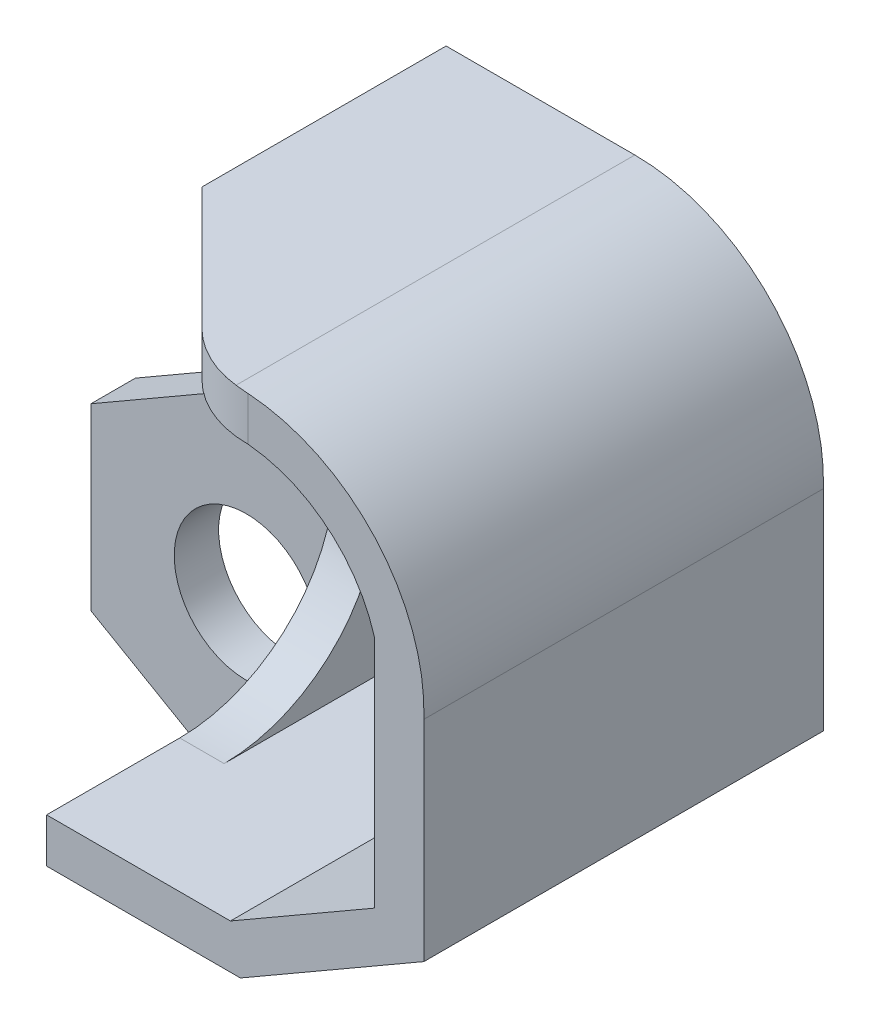
ISO-10303-21;
HEADER;
FILE_DESCRIPTION(('STEP AP214'),'2;1');
FILE_NAME('part.step','',(''),(''),'','','');
FILE_SCHEMA(('AUTOMOTIVE_DESIGN { 1 0 10303 214 1 1 1 1 }'));
ENDSEC;
DATA;
#1=APPLICATION_CONTEXT('core data for automotive mechanical design processes');
#2=APPLICATION_PROTOCOL_DEFINITION('international standard','automotive_design',2000,#1);
#3=PRODUCT_CONTEXT('',#1,'mechanical');
#4=PRODUCT('Part','Part','',(#3));
#5=PRODUCT_RELATED_PRODUCT_CATEGORY('part','',(#4));
#6=PRODUCT_DEFINITION_FORMATION('','',#4);
#7=PRODUCT_DEFINITION_CONTEXT('part definition',#1,'design');
#8=PRODUCT_DEFINITION('design','',#6,#7);
#9=PRODUCT_DEFINITION_SHAPE('','',#8);
#10=(LENGTH_UNIT() NAMED_UNIT(*) SI_UNIT(.MILLI.,.METRE.));
#11=(NAMED_UNIT(*) PLANE_ANGLE_UNIT() SI_UNIT($,.RADIAN.));
#12=(NAMED_UNIT(*) SI_UNIT($,.STERADIAN.) SOLID_ANGLE_UNIT());
#13=UNCERTAINTY_MEASURE_WITH_UNIT(LENGTH_MEASURE(1.E-05),#10,'distance_accuracy_value','');
#14=(GEOMETRIC_REPRESENTATION_CONTEXT(3) GLOBAL_UNCERTAINTY_ASSIGNED_CONTEXT((#13)) GLOBAL_UNIT_ASSIGNED_CONTEXT((#10,
#11,#12)) REPRESENTATION_CONTEXT('',''));
#15=CARTESIAN_POINT('',(0.,0.,0.));
#16=DIRECTION('',(0.,0.,1.));
#17=DIRECTION('',(1.,0.,0.));
#18=AXIS2_PLACEMENT_3D('',#15,#16,#17);
#19=CARTESIAN_POINT('',(15.5043494841321,15.5,2.));
#20=DIRECTION('',(0.,0.,-1.));
#21=DIRECTION('',(-1.,0.,0.));
#22=AXIS2_PLACEMENT_3D('',#19,#20,#21);
#23=PLANE('',#22);
#24=CARTESIAN_POINT('',(0.,0.,2.));
#25=DIRECTION('',(0.,0.,1.));
#26=DIRECTION('',(1.,0.,0.));
#27=AXIS2_PLACEMENT_3D('',#24,#25,#26);
#28=CIRCLE('',#27,3.25);
#29=CARTESIAN_POINT('',(3.25,0.,2.));
#30=VERTEX_POINT('',#29);
#31=EDGE_CURVE('E268',#30,#30,#28,.T.);
#32=ORIENTED_EDGE('',*,*,#31,.F.);
#33=EDGE_LOOP('',(#32));
#34=FACE_BOUND('',#33,.T.);
#35=DIRECTION('',(0.86602540378444,0.499999999999998,0.));
#36=VECTOR('',#35,1.);
#37=CARTESIAN_POINT('',(24.,5.7735026918962,2.));
#38=LINE('',#37,#36);
#39=CARTESIAN_POINT('',(1.87564434701784,-7.,2.));
#40=VERTEX_POINT('',#39);
#41=CARTESIAN_POINT('',(7.07269458429815,-3.99948164651422,2.));
#42=VERTEX_POINT('',#41);
#43=EDGE_CURVE('E286',#40,#42,#38,.T.);
#44=ORIENTED_EDGE('',*,*,#43,.T.);
#45=CARTESIAN_POINT('',(-10.4641016151379,-4.,2.));
#46=CARTESIAN_POINT('',(-4.64273441009191,-4.,2.));
#47=CARTESIAN_POINT('',(1.17863279495404,-4.,2.));
#48=CARTESIAN_POINT('',(7.,-4.,2.));
#49=CARTESIAN_POINT('',(9.91068360252297,-4.,2.));
#50=CARTESIAN_POINT('',(12.8213672050459,-1.5,2.));
#51=CARTESIAN_POINT('',(15.7320508075689,1.,2.));
#52=(BOUNDED_CURVE() B_SPLINE_CURVE(3,(#45,#46,#47,#48,#49,#50,#51),.UNSPECIFIED.,.F.,
.F.) B_SPLINE_CURVE_WITH_KNOTS((4,3,4),(-0.0174641016151379,0.,0.00873205080756893),
.UNSPECIFIED.) CURVE() GEOMETRIC_REPRESENTATION_ITEM() RATIONAL_B_SPLINE_CURVE((1.,1.,1.,1.,1.,
1.,1.)) REPRESENTATION_ITEM(''));
#53=CARTESIAN_POINT('',(7.,-4.,2.));
#54=VERTEX_POINT('',#53);
#55=EDGE_CURVE('E385',#42,#54,#52,.F.);
#56=ORIENTED_EDGE('',*,*,#55,.T.);
#57=DIRECTION('',(0.,-1.,0.));
#58=VECTOR('',#57,1.);
#59=CARTESIAN_POINT('',(7.,1.,2.));
#60=LINE('',#59,#58);
#61=CARTESIAN_POINT('',(7.,7.,2.));
#62=VERTEX_POINT('',#61);
#63=EDGE_CURVE('E235',#62,#54,#60,.T.);
#64=ORIENTED_EDGE('',*,*,#63,.F.);
#65=DIRECTION('',(-1.,0.,0.));
#66=VECTOR('',#65,1.);
#67=CARTESIAN_POINT('',(-1.87564434701784,7.,2.));
#68=LINE('',#67,#66);
#69=CARTESIAN_POINT('',(-1.87564434701784,7.,2.));
#70=VERTEX_POINT('',#69);
#71=EDGE_CURVE('E283',#62,#70,#68,.T.);
#72=ORIENTED_EDGE('',*,*,#71,.T.);
#73=DIRECTION('',(-0.86602540378444,-0.499999999999998,0.));
#74=VECTOR('',#73,1.);
#75=CARTESIAN_POINT('',(-6.99999999999999,4.04145188432739,2.));
#76=LINE('',#75,#74);
#77=CARTESIAN_POINT('',(-6.99999999999999,4.04145188432739,2.));
#78=VERTEX_POINT('',#77);
#79=EDGE_CURVE('E585',#70,#78,#76,.T.);
#80=ORIENTED_EDGE('',*,*,#79,.T.);
#81=DIRECTION('',(0.,-1.,0.));
#82=VECTOR('',#81,1.);
#83=CARTESIAN_POINT('',(-6.99999999999999,-4.04145188432739,2.));
#84=LINE('',#83,#82);
#85=CARTESIAN_POINT('',(-6.99999999999999,-4.04145188432739,2.));
#86=VERTEX_POINT('',#85);
#87=EDGE_CURVE('E514',#78,#86,#84,.T.);
#88=ORIENTED_EDGE('',*,*,#87,.T.);
#89=DIRECTION('',(0.86602540378444,-0.499999999999998,0.));
#90=VECTOR('',#89,1.);
#91=CARTESIAN_POINT('',(-1.87564434701784,-7.,2.));
#92=LINE('',#91,#90);
#93=CARTESIAN_POINT('',(-1.87564434701784,-7.,2.));
#94=VERTEX_POINT('',#93);
#95=EDGE_CURVE('E274',#86,#94,#92,.T.);
#96=ORIENTED_EDGE('',*,*,#95,.T.);
#97=DIRECTION('',(1.,0.,0.));
#98=VECTOR('',#97,1.);
#99=CARTESIAN_POINT('',(-1.87564434701784,-7.,2.));
#100=LINE('',#99,#98);
#101=EDGE_CURVE('E277',#94,#40,#100,.T.);
#102=ORIENTED_EDGE('',*,*,#101,.T.);
#103=EDGE_LOOP('',(#44,#56,#64,#72,#80,#88,#96,#102));
#104=FACE_BOUND('',#103,.T.);
#105=ADVANCED_FACE('F33',(#34,#104),#23,.F.);
#106=CARTESIAN_POINT('',(15.5043494841321,15.5,2.));
#107=DIRECTION('',(0.,0.,1.));
#108=DIRECTION('',(-1.,0.,0.));
#109=AXIS2_PLACEMENT_3D('',#106,#107,#108);
#110=CIRCLE('',#109,4.25);
#111=CARTESIAN_POINT('',(11.2543494841321,15.5,2.));
#112=VERTEX_POINT('',#111);
#113=EDGE_CURVE('E262',#112,#112,#110,.T.);
#114=ORIENTED_EDGE('',*,*,#113,.F.);
#115=EDGE_LOOP('',(#114));
#116=FACE_BOUND('',#115,.T.);
#117=DIRECTION('',(0.,1.,0.));
#118=VECTOR('',#117,1.);
#119=CARTESIAN_POINT('',(9.,22.,2.));
#120=LINE('',#119,#118);
#121=CARTESIAN_POINT('',(9.,3.,2.));
#122=VERTEX_POINT('',#121);
#123=CARTESIAN_POINT('',(9.,22.,2.));
#124=VERTEX_POINT('',#123);
#125=EDGE_CURVE('E211',#122,#124,#120,.T.);
#126=ORIENTED_EDGE('',*,*,#125,.F.);
#127=DIRECTION('',(-1.,0.,0.));
#128=VECTOR('',#127,1.);
#129=CARTESIAN_POINT('',(7.,3.,2.));
#130=LINE('',#129,#128);
#131=CARTESIAN_POINT('',(15.282660159026,3.,2.));
#132=VERTEX_POINT('',#131);
#133=EDGE_CURVE('E224',#132,#122,#130,.T.);
#134=ORIENTED_EDGE('',*,*,#133,.F.);
#135=DIRECTION('',(-0.866025403784439,-0.5,0.));
#136=VECTOR('',#135,1.);
#137=CARTESIAN_POINT('',(15.282660159026,3.,2.));
#138=LINE('',#137,#136);
#139=CARTESIAN_POINT('',(21.77610161737,6.748990173942,2.));
#140=VERTEX_POINT('',#139);
#141=EDGE_CURVE('E236',#140,#132,#138,.T.);
#142=ORIENTED_EDGE('',*,*,#141,.F.);
#143=DIRECTION('',(0.,-1.,0.));
#144=VECTOR('',#143,1.);
#145=CARTESIAN_POINT('',(21.77610161737,17.3027274781325,2.));
#146=LINE('',#145,#144);
#147=CARTESIAN_POINT('',(21.77610161737,17.3027274781325,2.));
#148=VERTEX_POINT('',#147);
#149=EDGE_CURVE('E240',#148,#140,#146,.T.);
#150=ORIENTED_EDGE('',*,*,#149,.F.);
#151=CARTESIAN_POINT('',(15.5043494841321,15.5,2.));
#152=DIRECTION('',(0.,0.,-1.));
#153=DIRECTION('',(1.,0.,0.));
#154=AXIS2_PLACEMENT_3D('',#151,#152,#153);
#155=CIRCLE('',#154,6.5256954557494);
#156=CARTESIAN_POINT('',(16.0828831315446,22.,2.));
#157=VERTEX_POINT('',#156);
#158=EDGE_CURVE('E297',#157,#148,#155,.T.);
#159=ORIENTED_EDGE('',*,*,#158,.F.);
#160=DIRECTION('',(1.,0.,0.));
#161=VECTOR('',#160,1.);
#162=CARTESIAN_POINT('',(7.,22.,2.));
#163=LINE('',#162,#161);
#164=EDGE_CURVE('E218',#124,#157,#163,.T.);
#165=ORIENTED_EDGE('',*,*,#164,.F.);
#166=EDGE_LOOP('',(#126,#134,#142,#150,#159,#165));
#167=FACE_BOUND('',#166,.T.);
#168=ADVANCED_FACE('F223',(#116,#167),#23,.F.);
#169=CARTESIAN_POINT('',(7.,22.,18.));
#170=DIRECTION('',(0.,1.,0.));
#171=DIRECTION('',(0.,0.,1.));
#172=AXIS2_PLACEMENT_3D('',#169,#170,#171);
#173=PLANE('',#172);
#174=DIRECTION('',(1.,0.,0.));
#175=VECTOR('',#174,1.);
#176=CARTESIAN_POINT('',(7.,22.,18.));
#177=LINE('',#176,#175);
#178=CARTESIAN_POINT('',(16.0710678118655,22.,18.));
#179=VERTEX_POINT('',#178);
#180=CARTESIAN_POINT('',(16.0828831315446,22.,18.));
#181=VERTEX_POINT('',#180);
#182=EDGE_CURVE('E238',#179,#181,#177,.T.);
#183=ORIENTED_EDGE('',*,*,#182,.F.);
#184=CARTESIAN_POINT('',(16.0710678118655,22.,13.));
#185=DIRECTION('',(0.,1.,0.));
#186=DIRECTION('',(0.,0.,1.));
#187=AXIS2_PLACEMENT_3D('',#184,#185,#186);
#188=CIRCLE('',#187,5.);
#189=CARTESIAN_POINT('',(12.5355339059327,22.,16.5355339059327));
#190=VERTEX_POINT('',#189);
#191=EDGE_CURVE('E605',#179,#190,#188,.F.);
#192=ORIENTED_EDGE('',*,*,#191,.T.);
#193=DIRECTION('',(-0.707106781186546,0.,-0.707106781186549));
#194=VECTOR('',#193,1.);
#195=CARTESIAN_POINT('',(14.,22.,18.));
#196=LINE('',#195,#194);
#197=CARTESIAN_POINT('',(8.00000000000001,22.,12.));
#198=VERTEX_POINT('',#197);
#199=EDGE_CURVE('E615',#190,#198,#196,.T.);
#200=ORIENTED_EDGE('',*,*,#199,.T.);
#201=DIRECTION('',(-1.,0.,0.));
#202=VECTOR('',#201,1.);
#203=CARTESIAN_POINT('',(7.,22.,12.));
#204=LINE('',#203,#202);
#205=CARTESIAN_POINT('',(9.,22.,12.));
#206=VERTEX_POINT('',#205);
#207=EDGE_CURVE('E624',#198,#206,#204,.F.);
#208=ORIENTED_EDGE('',*,*,#207,.T.);
#209=DIRECTION('',(0.,0.,-1.));
#210=VECTOR('',#209,1.);
#211=CARTESIAN_POINT('',(9.,22.,5.));
#212=LINE('',#211,#210);
#213=EDGE_CURVE('E219',#206,#124,#212,.T.);
#214=ORIENTED_EDGE('',*,*,#213,.T.);
#215=ORIENTED_EDGE('',*,*,#164,.T.);
#216=DIRECTION('',(0.,0.,-1.));
#217=VECTOR('',#216,1.);
#218=CARTESIAN_POINT('',(16.0828831315446,22.,18.));
#219=LINE('',#218,#217);
#220=EDGE_CURVE('E258',#181,#157,#219,.T.);
#221=ORIENTED_EDGE('',*,*,#220,.F.);
#222=EDGE_LOOP('',(#183,#192,#200,#208,#214,#215,#221));
#223=FACE_BOUND('',#222,.T.);
#224=ADVANCED_FACE('F328',(#223),#173,.F.);
#225=CARTESIAN_POINT('',(7.,3.,18.));
#226=DIRECTION('',(0.,-1.,0.));
#227=DIRECTION('',(1.,0.,0.));
#228=AXIS2_PLACEMENT_3D('',#225,#226,#227);
#229=PLANE('',#228);
#230=DIRECTION('',(0.,0.,-1.));
#231=VECTOR('',#230,1.);
#232=CARTESIAN_POINT('',(9.,3.,5.));
#233=LINE('',#232,#231);
#234=CARTESIAN_POINT('',(9.,3.,12.));
#235=VERTEX_POINT('',#234);
#236=EDGE_CURVE('E207',#235,#122,#233,.T.);
#237=ORIENTED_EDGE('',*,*,#236,.F.);
#238=DIRECTION('',(1.,0.,0.));
#239=VECTOR('',#238,1.);
#240=CARTESIAN_POINT('',(7.,3.,12.));
#241=LINE('',#240,#239);
#242=CARTESIAN_POINT('',(7.,3.,12.));
#243=VERTEX_POINT('',#242);
#244=EDGE_CURVE('E626',#235,#243,#241,.F.);
#245=ORIENTED_EDGE('',*,*,#244,.T.);
#246=DIRECTION('',(0.,0.,-1.));
#247=VECTOR('',#246,1.);
#248=CARTESIAN_POINT('',(7.,3.,18.));
#249=LINE('',#248,#247);
#250=CARTESIAN_POINT('',(7.,3.,18.));
#251=VERTEX_POINT('',#250);
#252=EDGE_CURVE('E247',#251,#243,#249,.T.);
#253=ORIENTED_EDGE('',*,*,#252,.F.);
#254=DIRECTION('',(-1.,0.,0.));
#255=VECTOR('',#254,1.);
#256=CARTESIAN_POINT('',(7.,3.,18.));
#257=LINE('',#256,#255);
#258=CARTESIAN_POINT('',(15.282660159026,3.,18.));
#259=VERTEX_POINT('',#258);
#260=EDGE_CURVE('E557',#259,#251,#257,.T.);
#261=ORIENTED_EDGE('',*,*,#260,.F.);
#262=DIRECTION('',(0.,0.,-1.));
#263=VECTOR('',#262,1.);
#264=CARTESIAN_POINT('',(15.282660159026,3.,18.));
#265=LINE('',#264,#263);
#266=EDGE_CURVE('E234',#259,#132,#265,.T.);
#267=ORIENTED_EDGE('',*,*,#266,.T.);
#268=ORIENTED_EDGE('',*,*,#133,.T.);
#269=EDGE_LOOP('',(#237,#245,#253,#261,#267,#268));
#270=FACE_BOUND('',#269,.T.);
#271=ADVANCED_FACE('F231',(#270),#229,.F.);
#272=CARTESIAN_POINT('',(15.5043494841321,15.5,0.));
#273=DIRECTION('',(0.,0.,-1.));
#274=DIRECTION('',(-1.,0.,0.));
#275=AXIS2_PLACEMENT_3D('',#272,#273,#274);
#276=PLANE('',#275);
#277=CARTESIAN_POINT('',(0.,0.,0.));
#278=DIRECTION('',(0.,0.,1.));
#279=DIRECTION('',(1.,0.,0.));
#280=AXIS2_PLACEMENT_3D('',#277,#278,#279);
#281=CIRCLE('',#280,3.25);
#282=CARTESIAN_POINT('',(3.25,0.,0.));
#283=VERTEX_POINT('',#282);
#284=EDGE_CURVE('E265',#283,#283,#281,.T.);
#285=ORIENTED_EDGE('',*,*,#284,.T.);
#286=EDGE_LOOP('',(#285));
#287=FACE_BOUND('',#286,.T.);
#288=DIRECTION('',(0.86602540378444,-0.499999999999998,0.));
#289=VECTOR('',#288,1.);
#290=CARTESIAN_POINT('',(-1.87564434701784,-7.,0.));
#291=LINE('',#290,#289);
#292=CARTESIAN_POINT('',(-6.99999999999999,-4.04145188432739,0.));
#293=VERTEX_POINT('',#292);
#294=CARTESIAN_POINT('',(-1.87564434701784,-7.,0.));
#295=VERTEX_POINT('',#294);
#296=EDGE_CURVE('E271',#293,#295,#291,.T.);
#297=ORIENTED_EDGE('',*,*,#296,.F.);
#298=DIRECTION('',(0.,-1.,0.));
#299=VECTOR('',#298,1.);
#300=CARTESIAN_POINT('',(-6.99999999999999,-4.04145188432739,0.));
#301=LINE('',#300,#299);
#302=CARTESIAN_POINT('',(-6.99999999999999,4.04145188432739,0.));
#303=VERTEX_POINT('',#302);
#304=EDGE_CURVE('E278',#303,#293,#301,.T.);
#305=ORIENTED_EDGE('',*,*,#304,.F.);
#306=DIRECTION('',(-0.86602540378444,-0.499999999999998,0.));
#307=VECTOR('',#306,1.);
#308=CARTESIAN_POINT('',(-6.99999999999999,4.04145188432739,0.));
#309=LINE('',#308,#307);
#310=CARTESIAN_POINT('',(-1.87564434701784,7.,0.));
#311=VERTEX_POINT('',#310);
#312=EDGE_CURVE('E507',#311,#303,#309,.T.);
#313=ORIENTED_EDGE('',*,*,#312,.F.);
#314=DIRECTION('',(-1.,0.,0.));
#315=VECTOR('',#314,1.);
#316=CARTESIAN_POINT('',(-1.87564434701784,7.,0.));
#317=LINE('',#316,#315);
#318=CARTESIAN_POINT('',(7.,7.,0.));
#319=VERTEX_POINT('',#318);
#320=EDGE_CURVE('E505',#319,#311,#317,.T.);
#321=ORIENTED_EDGE('',*,*,#320,.F.);
#322=DIRECTION('',(0.,-1.,0.));
#323=VECTOR('',#322,1.);
#324=CARTESIAN_POINT('',(7.,7.,0.));
#325=LINE('',#324,#323);
#326=CARTESIAN_POINT('',(7.,24.,0.));
#327=VERTEX_POINT('',#326);
#328=EDGE_CURVE('E503',#327,#319,#325,.T.);
#329=ORIENTED_EDGE('',*,*,#328,.F.);
#330=DIRECTION('',(-1.,0.,0.));
#331=VECTOR('',#330,1.);
#332=CARTESIAN_POINT('',(7.,24.,0.));
#333=LINE('',#332,#331);
#334=CARTESIAN_POINT('',(15.5043494841321,24.,0.));
#335=VERTEX_POINT('',#334);
#336=EDGE_CURVE('E500',#335,#327,#333,.T.);
#337=ORIENTED_EDGE('',*,*,#336,.F.);
#338=CARTESIAN_POINT('',(15.5043494841321,15.5,0.));
#339=DIRECTION('',(0.,0.,1.));
#340=DIRECTION('',(-1.,0.,0.));
#341=AXIS2_PLACEMENT_3D('',#338,#339,#340);
#342=CIRCLE('',#341,8.5);
#343=CARTESIAN_POINT('',(24.,15.2281134202769,0.));
#344=VERTEX_POINT('',#343);
#345=EDGE_CURVE('E494',#344,#335,#342,.T.);
#346=ORIENTED_EDGE('',*,*,#345,.F.);
#347=DIRECTION('',(0.,1.,0.));
#348=VECTOR('',#347,1.);
#349=CARTESIAN_POINT('',(24.,15.2281134202769,0.));
#350=LINE('',#349,#348);
#351=CARTESIAN_POINT('',(24.,5.7735026918962,0.));
#352=VERTEX_POINT('',#351);
#353=EDGE_CURVE('E492',#352,#344,#350,.T.);
#354=ORIENTED_EDGE('',*,*,#353,.F.);
#355=DIRECTION('',(0.86602540378444,0.499999999999998,0.));
#356=VECTOR('',#355,1.);
#357=CARTESIAN_POINT('',(24.,5.7735026918962,0.));
#358=LINE('',#357,#356);
#359=CARTESIAN_POINT('',(1.87564434701784,-7.,0.));
#360=VERTEX_POINT('',#359);
#361=EDGE_CURVE('E485',#360,#352,#358,.T.);
#362=ORIENTED_EDGE('',*,*,#361,.F.);
#363=DIRECTION('',(1.,0.,0.));
#364=VECTOR('',#363,1.);
#365=CARTESIAN_POINT('',(-1.87564434701784,-7.,0.));
#366=LINE('',#365,#364);
#367=EDGE_CURVE('E477',#295,#360,#366,.T.);
#368=ORIENTED_EDGE('',*,*,#367,.F.);
#369=EDGE_LOOP('',(#297,#305,#313,#321,#329,#337,#346,#354,#362,#368));
#370=FACE_BOUND('',#369,.T.);
#371=CARTESIAN_POINT('',(15.5043494841321,15.5,0.));
#372=DIRECTION('',(0.,0.,1.));
#373=DIRECTION('',(-1.,0.,0.));
#374=AXIS2_PLACEMENT_3D('',#371,#372,#373);
#375=CIRCLE('',#374,4.25);
#376=CARTESIAN_POINT('',(11.2543494841321,15.5,0.));
#377=VERTEX_POINT('',#376);
#378=EDGE_CURVE('E261',#377,#377,#375,.T.);
#379=ORIENTED_EDGE('',*,*,#378,.T.);
#380=EDGE_LOOP('',(#379));
#381=FACE_BOUND('',#380,.T.);
#382=ADVANCED_FACE('F327',(#287,#370,#381),#276,.T.);
#383=CARTESIAN_POINT('',(-1.87564434701784,-7.,2.));
#384=DIRECTION('',(0.499999999999998,0.86602540378444,0.));
#385=DIRECTION('',(-0.86602540378444,0.499999999999998,0.));
#386=AXIS2_PLACEMENT_3D('',#383,#384,#385);
#387=PLANE('',#386);
#388=ORIENTED_EDGE('',*,*,#296,.T.);
#389=DIRECTION('',(0.,0.,-1.));
#390=VECTOR('',#389,1.);
#391=CARTESIAN_POINT('',(-1.87564434701784,-7.,2.));
#392=LINE('',#391,#390);
#393=EDGE_CURVE('E290',#94,#295,#392,.T.);
#394=ORIENTED_EDGE('',*,*,#393,.F.);
#395=ORIENTED_EDGE('',*,*,#95,.F.);
#396=DIRECTION('',(0.,0.,-1.));
#397=VECTOR('',#396,1.);
#398=CARTESIAN_POINT('',(-6.99999999999999,-4.04145188432739,2.));
#399=LINE('',#398,#397);
#400=EDGE_CURVE('E510',#86,#293,#399,.T.);
#401=ORIENTED_EDGE('',*,*,#400,.T.);
#402=EDGE_LOOP('',(#388,#394,#395,#401));
#403=FACE_BOUND('',#402,.T.);
#404=ADVANCED_FACE('F357',(#403),#387,.F.);
#405=CARTESIAN_POINT('',(-1.87564434701784,-7.,2.));
#406=DIRECTION('',(0.,1.,0.));
#407=DIRECTION('',(0.,0.,1.));
#408=AXIS2_PLACEMENT_3D('',#405,#406,#407);
#409=PLANE('',#408);
#410=ORIENTED_EDGE('',*,*,#367,.T.);
#411=DIRECTION('',(0.,0.,-1.));
#412=VECTOR('',#411,1.);
#413=CARTESIAN_POINT('',(1.87564434701784,-7.,2.));
#414=LINE('',#413,#412);
#415=EDGE_CURVE('E479',#40,#360,#414,.T.);
#416=ORIENTED_EDGE('',*,*,#415,.F.);
#417=ORIENTED_EDGE('',*,*,#101,.F.);
#418=ORIENTED_EDGE('',*,*,#393,.T.);
#419=EDGE_LOOP('',(#410,#416,#417,#418));
#420=FACE_BOUND('',#419,.T.);
#421=ADVANCED_FACE('F468',(#420),#409,.F.);
#422=CARTESIAN_POINT('',(24.,5.7735026918962,2.));
#423=DIRECTION('',(-0.499999999999998,0.86602540378444,0.));
#424=DIRECTION('',(-0.86602540378444,-0.499999999999998,0.));
#425=AXIS2_PLACEMENT_3D('',#422,#423,#424);
#426=PLANE('',#425);
#427=ORIENTED_EDGE('',*,*,#361,.T.);
#428=DIRECTION('',(0.,0.,-1.));
#429=VECTOR('',#428,1.);
#430=CARTESIAN_POINT('',(24.,5.7735026918962,2.));
#431=LINE('',#430,#429);
#432=CARTESIAN_POINT('',(24.,5.7735026918962,18.));
#433=VERTEX_POINT('',#432);
#434=EDGE_CURVE('E488',#433,#352,#431,.T.);
#435=ORIENTED_EDGE('',*,*,#434,.F.);
#436=DIRECTION('',(0.866025403784439,0.5,0.));
#437=VECTOR('',#436,1.);
#438=CARTESIAN_POINT('',(15.732050807569,1.,18.));
#439=LINE('',#438,#437);
#440=CARTESIAN_POINT('',(15.732050807569,1.,18.));
#441=VERTEX_POINT('',#440);
#442=EDGE_CURVE('E536',#441,#433,#439,.T.);
#443=ORIENTED_EDGE('',*,*,#442,.F.);
#444=DIRECTION('',(0.,0.,-1.));
#445=VECTOR('',#444,1.);
#446=CARTESIAN_POINT('',(15.732050807569,1.,18.));
#447=LINE('',#446,#445);
#448=CARTESIAN_POINT('',(15.7320508075689,1.,2.));
#449=VERTEX_POINT('',#448);
#450=EDGE_CURVE('E248',#441,#449,#447,.T.);
#451=ORIENTED_EDGE('',*,*,#450,.T.);
#452=CARTESIAN_POINT('',(7.07269458429754,-3.99948164651344,2.));
#453=CARTESIAN_POINT('',(7.61835428858763,-3.68444486935609,1.99999999999976));
#454=CARTESIAN_POINT('',(8.22999648835141,-3.33131308067464,1.99999999999979));
#455=CARTESIAN_POINT('',(9.55225462022993,-2.56790699229604,2.00000000000046));
#456=CARTESIAN_POINT('',(10.2628705590933,-2.15763268870327,2.00000000000015));
#457=CARTESIAN_POINT('',(12.4936921039283,-0.869667269278817,2.00000000000012));
#458=CARTESIAN_POINT('',(14.1128714593411,0.0651663659197213,2.00000000442799));
#459=CARTESIAN_POINT('',(15.7320508075689,1.,2.));
#460=(BOUNDED_CURVE() B_SPLINE_CURVE(3,(#452,#453,#454,#455,#456,#457,#458,#459),.UNSPECIFIED.,
.F.,.F.) B_SPLINE_CURVE_WITH_KNOTS((4,2,2,4),(7.26945842973503E-05,0.00223753364011524,
0.00440237269593314,0.00873205080756893),
.UNSPECIFIED.) CURVE() GEOMETRIC_REPRESENTATION_ITEM() RATIONAL_B_SPLINE_CURVE((0.999999999999906,
0.999999999999913,0.999999999999917,0.999999999999924,0.999999999999926,0.999999999999931,
0.999999999999932,0.999999999999932)) REPRESENTATION_ITEM(''));
#461=EDGE_CURVE('E280',#42,#449,#460,.T.);
#462=ORIENTED_EDGE('',*,*,#461,.F.);
#463=ORIENTED_EDGE('',*,*,#43,.F.);
#464=ORIENTED_EDGE('',*,*,#415,.T.);
#465=EDGE_LOOP('',(#427,#435,#443,#451,#462,#463,#464));
#466=FACE_BOUND('',#465,.T.);
#467=ADVANCED_FACE('F458',(#466),#426,.F.);
#468=CARTESIAN_POINT('',(24.,15.2281134202769,2.));
#469=DIRECTION('',(-1.,0.,0.));
#470=DIRECTION('',(0.,0.,1.));
#471=AXIS2_PLACEMENT_3D('',#468,#469,#470);
#472=PLANE('',#471);
#473=ORIENTED_EDGE('',*,*,#353,.T.);
#474=DIRECTION('',(0.,0.,-1.));
#475=VECTOR('',#474,1.);
#476=CARTESIAN_POINT('',(24.,15.2281134202769,2.));
#477=LINE('',#476,#475);
#478=CARTESIAN_POINT('',(24.,15.2281134202769,18.));
#479=VERTEX_POINT('',#478);
#480=EDGE_CURVE('E527',#479,#344,#477,.T.);
#481=ORIENTED_EDGE('',*,*,#480,.F.);
#482=DIRECTION('',(0.,1.,0.));
#483=VECTOR('',#482,1.);
#484=CARTESIAN_POINT('',(24.,15.2281134202769,18.));
#485=LINE('',#484,#483);
#486=EDGE_CURVE('E533',#433,#479,#485,.T.);
#487=ORIENTED_EDGE('',*,*,#486,.F.);
#488=ORIENTED_EDGE('',*,*,#434,.T.);
#489=EDGE_LOOP('',(#473,#481,#487,#488));
#490=FACE_BOUND('',#489,.T.);
#491=ADVANCED_FACE('F467',(#490),#472,.F.);
#492=CARTESIAN_POINT('',(15.5043494841321,15.5,2.));
#493=DIRECTION('',(0.,0.,-1.));
#494=DIRECTION('',(-1.,0.,0.));
#495=AXIS2_PLACEMENT_3D('',#492,#493,#494);
#496=CYLINDRICAL_SURFACE('',#495,8.5);
#497=DIRECTION('',(0.,0.,-1.));
#498=VECTOR('',#497,1.);
#499=CARTESIAN_POINT('',(15.5043494841321,24.,2.));
#500=LINE('',#499,#498);
#501=CARTESIAN_POINT('',(15.5043494841321,24.,17.9677792158077));
#502=VERTEX_POINT('',#501);
#503=EDGE_CURVE('E525',#502,#335,#500,.T.);
#504=ORIENTED_EDGE('',*,*,#503,.F.);
#505=CARTESIAN_POINT('',(15.5043494841321,24.,17.9677792158077));
#506=CARTESIAN_POINT('',(15.5986026374744,24.000009295884,17.9785211223258));
#507=CARTESIAN_POINT('',(15.6929557414568,23.9984378292242,17.9865771409342));
#508=CARTESIAN_POINT('',(15.8818618507013,23.9921333708173,17.9973174023316));
#509=CARTESIAN_POINT('',(15.9764148559634,23.9874003790702,18.0000016451206));
#510=CARTESIAN_POINT('',(16.0710678118655,23.9810866247793,18.));
#511=B_SPLINE_CURVE_WITH_KNOTS('',3,(#505,#506,#507,#508,#509,#510),.UNSPECIFIED.,.F.,.F.,(4,2,
4),(0.,0.284128306526349,0.568256613051529),.UNSPECIFIED.);
#512=CARTESIAN_POINT('',(16.0710678118655,23.9810866247793,18.));
#513=VERTEX_POINT('',#512);
#514=EDGE_CURVE('E11',#502,#513,#511,.T.);
#515=ORIENTED_EDGE('',*,*,#514,.T.);
#516=CARTESIAN_POINT('',(15.5043494841321,15.5,18.));
#517=DIRECTION('',(0.,0.,1.));
#518=DIRECTION('',(1.,0.,0.));
#519=AXIS2_PLACEMENT_3D('',#516,#517,#518);
#520=CIRCLE('',#519,8.5);
#521=EDGE_CURVE('E543',#479,#513,#520,.T.);
#522=ORIENTED_EDGE('',*,*,#521,.F.);
#523=ORIENTED_EDGE('',*,*,#480,.T.);
#524=ORIENTED_EDGE('',*,*,#345,.T.);
#525=EDGE_LOOP('',(#504,#515,#522,#523,#524));
#526=FACE_BOUND('',#525,.T.);
#527=ADVANCED_FACE('F599',(#526),#496,.T.);
#528=CARTESIAN_POINT('',(7.,24.,2.));
#529=DIRECTION('',(0.,-1.,0.));
#530=DIRECTION('',(0.,0.,-1.));
#531=AXIS2_PLACEMENT_3D('',#528,#529,#530);
#532=PLANE('',#531);
#533=DIRECTION('',(0.707106781186546,0.,0.707106781186549));
#534=VECTOR('',#533,1.);
#535=CARTESIAN_POINT('',(14.,24.,18.));
#536=LINE('',#535,#534);
#537=CARTESIAN_POINT('',(7.,24.,11.));
#538=VERTEX_POINT('',#537);
#539=CARTESIAN_POINT('',(12.5355339059327,24.,16.5355339059327));
#540=VERTEX_POINT('',#539);
#541=EDGE_CURVE('E606',#538,#540,#536,.T.);
#542=ORIENTED_EDGE('',*,*,#541,.T.);
#543=CARTESIAN_POINT('',(16.0710678118655,24.,13.));
#544=DIRECTION('',(0.,-1.,0.));
#545=DIRECTION('',(0.,0.,-1.));
#546=AXIS2_PLACEMENT_3D('',#543,#544,#545);
#547=CIRCLE('',#546,5.);
#548=EDGE_CURVE('E46',#540,#502,#547,.F.);
#549=ORIENTED_EDGE('',*,*,#548,.T.);
#550=ORIENTED_EDGE('',*,*,#503,.T.);
#551=ORIENTED_EDGE('',*,*,#336,.T.);
#552=DIRECTION('',(0.,0.,-1.));
#553=VECTOR('',#552,1.);
#554=CARTESIAN_POINT('',(7.,24.,2.));
#555=LINE('',#554,#553);
#556=EDGE_CURVE('E523',#538,#327,#555,.T.);
#557=ORIENTED_EDGE('',*,*,#556,.F.);
#558=EDGE_LOOP('',(#542,#549,#550,#551,#557));
#559=FACE_BOUND('',#558,.T.);
#560=ADVANCED_FACE('F374',(#559),#532,.F.);
#561=CARTESIAN_POINT('',(7.,7.,2.));
#562=DIRECTION('',(1.,0.,0.));
#563=DIRECTION('',(0.,0.,-1.));
#564=AXIS2_PLACEMENT_3D('',#561,#562,#563);
#565=PLANE('',#564);
#566=CARTESIAN_POINT('',(7.,15.,12.));
#567=DIRECTION('',(1.,0.,0.));
#568=DIRECTION('',(0.,0.,-1.));
#569=AXIS2_PLACEMENT_3D('',#566,#567,#568);
#570=CIRCLE('',#569,7.);
#571=CARTESIAN_POINT('',(7.,15.,5.));
#572=VERTEX_POINT('',#571);
#573=CARTESIAN_POINT('',(7.,21.9282032302755,11.));
#574=VERTEX_POINT('',#573);
#575=EDGE_CURVE('E619',#572,#574,#570,.T.);
#576=ORIENTED_EDGE('',*,*,#575,.T.);
#577=DIRECTION('',(0.,1.,0.));
#578=VECTOR('',#577,1.);
#579=CARTESIAN_POINT('',(7.,24.,11.));
#580=LINE('',#579,#578);
#581=EDGE_CURVE('E596',#574,#538,#580,.T.);
#582=ORIENTED_EDGE('',*,*,#581,.T.);
#583=ORIENTED_EDGE('',*,*,#556,.T.);
#584=ORIENTED_EDGE('',*,*,#328,.T.);
#585=DIRECTION('',(0.,0.,-1.));
#586=VECTOR('',#585,1.);
#587=CARTESIAN_POINT('',(7.,7.,2.));
#588=LINE('',#587,#586);
#589=EDGE_CURVE('E520',#62,#319,#588,.T.);
#590=ORIENTED_EDGE('',*,*,#589,.F.);
#591=ORIENTED_EDGE('',*,*,#63,.T.);
#592=CARTESIAN_POINT('',(7.,-4.,2.));
#593=CARTESIAN_POINT('',(7.,-3.85936970517684,1.99998487765603));
#594=CARTESIAN_POINT('',(7.,-3.71874158087119,2.0059324291553));
#595=CARTESIAN_POINT('',(7.,-3.43849149354306,2.02964365808959));
#596=CARTESIAN_POINT('',(7.,-3.29886948258023,2.04740676871047));
#597=CARTESIAN_POINT('',(7.,-3.02172450703937,2.09462206846145));
#598=CARTESIAN_POINT('',(7.,-2.88420003610313,2.12406541497546));
#599=CARTESIAN_POINT('',(6.99999999999999,-2.61212048113554,2.19442700367785));
#600=CARTESIAN_POINT('',(6.99999999999999,-2.47756536087839,2.2353451057917));
#601=CARTESIAN_POINT('',(6.99999999999999,-2.21233860408696,2.32838104055623));
#602=CARTESIAN_POINT('',(6.99999999999999,-2.08166815509555,2.38050225872392));
#603=CARTESIAN_POINT('',(7.,-1.82513457763765,2.49558760725056));
#604=CARTESIAN_POINT('',(7.,-1.69927324398741,2.55855573842751));
#605=CARTESIAN_POINT('',(7.,-1.45337138545643,2.69483658103041));
#606=CARTESIAN_POINT('',(7.,-1.33332772466987,2.76814363421833));
#607=CARTESIAN_POINT('',(7.,-1.09979769094733,2.9246361710117));
#608=CARTESIAN_POINT('',(7.,-0.986313749467577,3.00782528308238));
#609=CARTESIAN_POINT('',(7.,-0.766799847552071,3.18343536468632));
#610=CARTESIAN_POINT('',(7.,-0.660767070576009,3.27585281357819));
#611=CARTESIAN_POINT('',(7.,-0.45682343090945,3.46932537624052));
#612=CARTESIAN_POINT('',(7.,-0.358915608527587,3.57038369490871));
#613=CARTESIAN_POINT('',(7.,-0.171977934536532,3.78037208220973));
#614=CARTESIAN_POINT('',(7.,-0.0829465939179559,3.88930082529171));
#615=CARTESIAN_POINT('',(7.,0.0856539829543582,4.11431072431116));
#616=CARTESIAN_POINT('',(7.,0.165219843063631,4.23039440999279));
#617=CARTESIAN_POINT('',(7.,0.314287934565798,4.46885584595107));
#618=CARTESIAN_POINT('',(7.,0.383790004429252,4.59123369720986));
#619=CARTESIAN_POINT('',(7.,0.512234739337785,4.84140998230249));
#620=CARTESIAN_POINT('',(7.,0.571177359279544,4.96920843928687));
#621=CARTESIAN_POINT('',(7.,0.678058337191619,5.22926041653177));
#622=CARTESIAN_POINT('',(7.,0.72600197415301,5.36151176451571));
#623=CARTESIAN_POINT('',(7.,0.810569337872634,5.62953366520381));
#624=CARTESIAN_POINT('',(6.99999999999999,0.847195529571877,5.76530344460112));
#625=CARTESIAN_POINT('',(6.99999999999999,0.918551261056648,6.08246320865253));
#626=CARTESIAN_POINT('',(7.,0.949093527695138,6.26482253632015));
#627=CARTESIAN_POINT('',(7.,0.979633814095278,6.53982554565282));
#628=CARTESIAN_POINT('',(7.,0.9872683838844,6.63169050822272));
#629=CARTESIAN_POINT('',(7.,0.997450863875645,6.81569611489433));
#630=CARTESIAN_POINT('',(7.,0.999999095975954,6.90783674118052));
#631=CARTESIAN_POINT('',(6.99999999999999,1.,7.));
#632=B_SPLINE_CURVE_WITH_KNOTS('',3,(#592,#593,#594,#595,#596,#597,#598,#599,#600,#601,#602,
#603,#604,#605,#606,#607,#608,#609,#610,#611,#612,#613,#614,#615,#616,#617,#618,#619,#620,#621,
#622,#623,#624,#625,#626,#627,#628,#629,#630,#631),.UNSPECIFIED.,.F.,.F.,(4,2,2,2,2,2,2,2,2,2,2,
2,2,2,2,2,2,2,2,4),(0.,0.421762112767218,0.84350399428834,1.26492720019807,1.68634526193874,
2.10789085328031,2.52959226338584,2.95106377581116,3.37269052404696,3.79415703039291,
4.21578054240968,4.63733320863239,5.05903578615341,5.48074513148561,5.90245627805163,
6.32396459780853,6.7453810481854,7.298792312716,7.57521919596009,7.85162858446835),.UNSPECIFIED.);
#633=CARTESIAN_POINT('',(7.,1.,7.));
#634=VERTEX_POINT('',#633);
#635=EDGE_CURVE('E377',#54,#634,#632,.T.);
#636=ORIENTED_EDGE('',*,*,#635,.T.);
#637=DIRECTION('',(0.,0.,-1.));
#638=VECTOR('',#637,1.);
#639=CARTESIAN_POINT('',(7.,1.,18.));
#640=LINE('',#639,#638);
#641=CARTESIAN_POINT('',(7.,1.,18.));
#642=VERTEX_POINT('',#641);
#643=EDGE_CURVE('E244',#642,#634,#640,.T.);
#644=ORIENTED_EDGE('',*,*,#643,.F.);
#645=DIRECTION('',(0.,-1.,0.));
#646=VECTOR('',#645,1.);
#647=CARTESIAN_POINT('',(7.,1.,18.));
#648=LINE('',#647,#646);
#649=EDGE_CURVE('E545',#251,#642,#648,.T.);
#650=ORIENTED_EDGE('',*,*,#649,.F.);
#651=ORIENTED_EDGE('',*,*,#252,.T.);
#652=CARTESIAN_POINT('',(7.,10.,12.));
#653=DIRECTION('',(1.,0.,0.));
#654=DIRECTION('',(0.,0.,-1.));
#655=AXIS2_PLACEMENT_3D('',#652,#653,#654);
#656=CIRCLE('',#655,7.);
#657=CARTESIAN_POINT('',(7.,10.,5.));
#658=VERTEX_POINT('',#657);
#659=EDGE_CURVE('E621',#243,#658,#656,.T.);
#660=ORIENTED_EDGE('',*,*,#659,.T.);
#661=DIRECTION('',(0.,-1.,0.));
#662=VECTOR('',#661,1.);
#663=CARTESIAN_POINT('',(7.,22.,5.));
#664=LINE('',#663,#662);
#665=EDGE_CURVE('E227',#572,#658,#664,.T.);
#666=ORIENTED_EDGE('',*,*,#665,.F.);
#667=EDGE_LOOP('',(#576,#582,#583,#584,#590,#591,#636,#644,#650,#651,#660,#666));
#668=FACE_BOUND('',#667,.T.);
#669=ADVANCED_FACE('F369',(#668),#565,.F.);
#670=CARTESIAN_POINT('',(-1.87564434701784,7.,2.));
#671=DIRECTION('',(0.,-1.,0.));
#672=DIRECTION('',(0.,0.,-1.));
#673=AXIS2_PLACEMENT_3D('',#670,#671,#672);
#674=PLANE('',#673);
#675=ORIENTED_EDGE('',*,*,#320,.T.);
#676=DIRECTION('',(0.,0.,-1.));
#677=VECTOR('',#676,1.);
#678=CARTESIAN_POINT('',(-1.87564434701784,7.,2.));
#679=LINE('',#678,#677);
#680=EDGE_CURVE('E517',#70,#311,#679,.T.);
#681=ORIENTED_EDGE('',*,*,#680,.F.);
#682=ORIENTED_EDGE('',*,*,#71,.F.);
#683=ORIENTED_EDGE('',*,*,#589,.T.);
#684=EDGE_LOOP('',(#675,#681,#682,#683));
#685=FACE_BOUND('',#684,.T.);
#686=ADVANCED_FACE('F365',(#685),#674,.F.);
#687=CARTESIAN_POINT('',(-6.99999999999999,4.04145188432739,2.));
#688=DIRECTION('',(0.499999999999998,-0.86602540378444,0.));
#689=DIRECTION('',(0.86602540378444,0.499999999999998,0.));
#690=AXIS2_PLACEMENT_3D('',#687,#688,#689);
#691=PLANE('',#690);
#692=ORIENTED_EDGE('',*,*,#312,.T.);
#693=DIRECTION('',(0.,0.,-1.));
#694=VECTOR('',#693,1.);
#695=CARTESIAN_POINT('',(-6.99999999999999,4.04145188432739,2.));
#696=LINE('',#695,#694);
#697=EDGE_CURVE('E513',#78,#303,#696,.T.);
#698=ORIENTED_EDGE('',*,*,#697,.F.);
#699=ORIENTED_EDGE('',*,*,#79,.F.);
#700=ORIENTED_EDGE('',*,*,#680,.T.);
#701=EDGE_LOOP('',(#692,#698,#699,#700));
#702=FACE_BOUND('',#701,.T.);
#703=ADVANCED_FACE('F361',(#702),#691,.F.);
#704=CARTESIAN_POINT('',(-6.99999999999999,-4.04145188432739,2.));
#705=DIRECTION('',(1.,0.,0.));
#706=DIRECTION('',(0.,0.,-1.));
#707=AXIS2_PLACEMENT_3D('',#704,#705,#706);
#708=PLANE('',#707);
#709=ORIENTED_EDGE('',*,*,#304,.T.);
#710=ORIENTED_EDGE('',*,*,#400,.F.);
#711=ORIENTED_EDGE('',*,*,#87,.F.);
#712=ORIENTED_EDGE('',*,*,#697,.T.);
#713=EDGE_LOOP('',(#709,#710,#711,#712));
#714=FACE_BOUND('',#713,.T.);
#715=ADVANCED_FACE('F350',(#714),#708,.F.);
#716=CARTESIAN_POINT('',(0.,0.,2.));
#717=DIRECTION('',(0.,0.,-1.));
#718=DIRECTION('',(-1.,0.,0.));
#719=AXIS2_PLACEMENT_3D('',#716,#717,#718);
#720=CYLINDRICAL_SURFACE('',#719,3.25);
#721=ORIENTED_EDGE('',*,*,#31,.T.);
#722=EDGE_LOOP('',(#721));
#723=FACE_BOUND('',#722,.T.);
#724=ORIENTED_EDGE('',*,*,#284,.F.);
#725=EDGE_LOOP('',(#724));
#726=FACE_BOUND('',#725,.T.);
#727=ADVANCED_FACE('F346',(#723,#726),#720,.F.);
#728=CARTESIAN_POINT('',(15.5043494841321,15.5,2.));
#729=DIRECTION('',(0.,0.,-1.));
#730=DIRECTION('',(-1.,0.,0.));
#731=AXIS2_PLACEMENT_3D('',#728,#729,#730);
#732=CYLINDRICAL_SURFACE('',#731,4.25);
#733=ORIENTED_EDGE('',*,*,#113,.T.);
#734=EDGE_LOOP('',(#733));
#735=FACE_BOUND('',#734,.T.);
#736=ORIENTED_EDGE('',*,*,#378,.F.);
#737=EDGE_LOOP('',(#736));
#738=FACE_BOUND('',#737,.T.);
#739=ADVANCED_FACE('F339',(#735,#738),#732,.F.);
#740=CARTESIAN_POINT('',(15.5043494841321,15.5,18.));
#741=DIRECTION('',(0.,0.,-1.));
#742=DIRECTION('',(-1.,0.,0.));
#743=AXIS2_PLACEMENT_3D('',#740,#741,#742);
#744=CYLINDRICAL_SURFACE('',#743,6.5256954557494);
#745=ORIENTED_EDGE('',*,*,#158,.T.);
#746=DIRECTION('',(0.,0.,-1.));
#747=VECTOR('',#746,1.);
#748=CARTESIAN_POINT('',(21.77610161737,17.3027274781325,18.));
#749=LINE('',#748,#747);
#750=CARTESIAN_POINT('',(21.77610161737,17.3027274781325,18.));
#751=VERTEX_POINT('',#750);
#752=EDGE_CURVE('E255',#751,#148,#749,.T.);
#753=ORIENTED_EDGE('',*,*,#752,.F.);
#754=CARTESIAN_POINT('',(15.5043494841321,15.5,18.));
#755=DIRECTION('',(0.,0.,-1.));
#756=DIRECTION('',(1.,0.,0.));
#757=AXIS2_PLACEMENT_3D('',#754,#755,#756);
#758=CIRCLE('',#757,6.5256954557494);
#759=EDGE_CURVE('E561',#181,#751,#758,.T.);
#760=ORIENTED_EDGE('',*,*,#759,.F.);
#761=ORIENTED_EDGE('',*,*,#220,.T.);
#762=EDGE_LOOP('',(#745,#753,#760,#761));
#763=FACE_BOUND('',#762,.T.);
#764=ADVANCED_FACE('F335',(#763),#744,.F.);
#765=CARTESIAN_POINT('',(21.77610161737,17.3027274781325,18.));
#766=DIRECTION('',(1.,0.,0.));
#767=DIRECTION('',(0.,0.,-1.));
#768=AXIS2_PLACEMENT_3D('',#765,#766,#767);
#769=PLANE('',#768);
#770=ORIENTED_EDGE('',*,*,#149,.T.);
#771=DIRECTION('',(0.,0.,-1.));
#772=VECTOR('',#771,1.);
#773=CARTESIAN_POINT('',(21.77610161737,6.748990173942,18.));
#774=LINE('',#773,#772);
#775=CARTESIAN_POINT('',(21.77610161737,6.748990173942,18.));
#776=VERTEX_POINT('',#775);
#777=EDGE_CURVE('E252',#776,#140,#774,.T.);
#778=ORIENTED_EDGE('',*,*,#777,.F.);
#779=DIRECTION('',(0.,-1.,0.));
#780=VECTOR('',#779,1.);
#781=CARTESIAN_POINT('',(21.77610161737,17.3027274781325,18.));
#782=LINE('',#781,#780);
#783=EDGE_CURVE('E558',#751,#776,#782,.T.);
#784=ORIENTED_EDGE('',*,*,#783,.F.);
#785=ORIENTED_EDGE('',*,*,#752,.T.);
#786=EDGE_LOOP('',(#770,#778,#784,#785));
#787=FACE_BOUND('',#786,.T.);
#788=ADVANCED_FACE('F331',(#787),#769,.F.);
#789=CARTESIAN_POINT('',(15.282660159026,3.,18.));
#790=DIRECTION('',(0.5,-0.866025403784439,0.));
#791=DIRECTION('',(0.866025403784439,0.5,0.));
#792=AXIS2_PLACEMENT_3D('',#789,#790,#791);
#793=PLANE('',#792);
#794=ORIENTED_EDGE('',*,*,#141,.T.);
#795=ORIENTED_EDGE('',*,*,#266,.F.);
#796=DIRECTION('',(-0.866025403784439,-0.5,0.));
#797=VECTOR('',#796,1.);
#798=CARTESIAN_POINT('',(15.282660159026,3.,18.));
#799=LINE('',#798,#797);
#800=EDGE_CURVE('E556',#776,#259,#799,.T.);
#801=ORIENTED_EDGE('',*,*,#800,.F.);
#802=ORIENTED_EDGE('',*,*,#777,.T.);
#803=EDGE_LOOP('',(#794,#795,#801,#802));
#804=FACE_BOUND('',#803,.T.);
#805=ADVANCED_FACE('F323',(#804),#793,.F.);
#806=CARTESIAN_POINT('',(7.,1.,18.));
#807=DIRECTION('',(0.,1.,0.));
#808=DIRECTION('',(0.,0.,1.));
#809=AXIS2_PLACEMENT_3D('',#806,#807,#808);
#810=PLANE('',#809);
#811=ORIENTED_EDGE('',*,*,#643,.T.);
#812=CARTESIAN_POINT('',(-10.4641016151379,1.,7.));
#813=CARTESIAN_POINT('',(-4.64273441009191,1.,7.));
#814=CARTESIAN_POINT('',(1.17863279495404,1.,7.));
#815=CARTESIAN_POINT('',(7.,1.,7.));
#816=CARTESIAN_POINT('',(9.91068360252297,1.,7.));
#817=CARTESIAN_POINT('',(12.8213672050459,1.,4.5));
#818=CARTESIAN_POINT('',(15.7320508075689,1.,2.));
#819=(BOUNDED_CURVE() B_SPLINE_CURVE(3,(#812,#813,#814,#815,#816,#817,#818),.UNSPECIFIED.,.F.,
.F.) B_SPLINE_CURVE_WITH_KNOTS((4,3,4),(-0.0174641016151379,0.,0.00873205080756893),
.UNSPECIFIED.) CURVE() GEOMETRIC_REPRESENTATION_ITEM() RATIONAL_B_SPLINE_CURVE((1.,1.,1.,1.,1.,
1.,1.)) REPRESENTATION_ITEM(''));
#820=CARTESIAN_POINT('',(7.07269458429735,1.,6.99948164651423));
#821=VERTEX_POINT('',#820);
#822=EDGE_CURVE('E310',#634,#821,#819,.T.);
#823=ORIENTED_EDGE('',*,*,#822,.T.);
#824=CARTESIAN_POINT('',(15.7320508075689,1.,2.));
#825=CARTESIAN_POINT('',(14.2896791897768,1.,3.18788975331893));
#826=CARTESIAN_POINT('',(12.8455987331438,1.,4.38087349814816));
#827=CARTESIAN_POINT('',(10.6807596773278,1.,5.79096558284602));
#828=CARTESIAN_POINT('',(9.9591466587212,1.,6.19769766108816));
#829=CARTESIAN_POINT('',(8.51592062150927,1.,6.79539402595759));
#830=CARTESIAN_POINT('',(7.79433536775143,1.,6.9892045348588));
#831=CARTESIAN_POINT('',(7.07269458429735,1.,6.99948164651423));
#832=(BOUNDED_CURVE() B_SPLINE_CURVE(3,(#824,#825,#826,#827,#828,#829,#830,#831),.UNSPECIFIED.,
.F.,.F.) B_SPLINE_CURVE_WITH_KNOTS((4,2,2,4),(7.269458429735E-05,0.00440237269593314,
0.00656721175175103,0.00873205080756893),
.UNSPECIFIED.) CURVE() GEOMETRIC_REPRESENTATION_ITEM() RATIONAL_B_SPLINE_CURVE((1.,1.,1.,1.,1.,
1.,1.,1.)) REPRESENTATION_ITEM(''));
#833=EDGE_CURVE('E304',#821,#449,#832,.F.);
#834=ORIENTED_EDGE('',*,*,#833,.T.);
#835=ORIENTED_EDGE('',*,*,#450,.F.);
#836=DIRECTION('',(1.,0.,0.));
#837=VECTOR('',#836,1.);
#838=CARTESIAN_POINT('',(7.,1.,18.));
#839=LINE('',#838,#837);
#840=EDGE_CURVE('E541',#642,#441,#839,.T.);
#841=ORIENTED_EDGE('',*,*,#840,.F.);
#842=EDGE_LOOP('',(#811,#823,#834,#835,#841));
#843=FACE_BOUND('',#842,.T.);
#844=ADVANCED_FACE('F312',(#843),#810,.F.);
#845=CARTESIAN_POINT('',(15.5043494841321,15.5,18.));
#846=DIRECTION('',(0.,0.,1.));
#847=DIRECTION('',(1.,0.,0.));
#848=AXIS2_PLACEMENT_3D('',#845,#846,#847);
#849=PLANE('',#848);
#850=ORIENTED_EDGE('',*,*,#521,.T.);
#851=DIRECTION('',(0.,-1.,0.));
#852=VECTOR('',#851,1.);
#853=CARTESIAN_POINT('',(16.0710678118655,15.5,18.));
#854=LINE('',#853,#852);
#855=EDGE_CURVE('E602',#513,#179,#854,.T.);
#856=ORIENTED_EDGE('',*,*,#855,.T.);
#857=ORIENTED_EDGE('',*,*,#182,.T.);
#858=ORIENTED_EDGE('',*,*,#759,.T.);
#859=ORIENTED_EDGE('',*,*,#783,.T.);
#860=ORIENTED_EDGE('',*,*,#800,.T.);
#861=ORIENTED_EDGE('',*,*,#260,.T.);
#862=ORIENTED_EDGE('',*,*,#649,.T.);
#863=ORIENTED_EDGE('',*,*,#840,.T.);
#864=ORIENTED_EDGE('',*,*,#442,.T.);
#865=ORIENTED_EDGE('',*,*,#486,.T.);
#866=EDGE_LOOP('',(#850,#856,#857,#858,#859,#860,#861,#862,#863,#864,#865));
#867=FACE_BOUND('',#866,.T.);
#868=ADVANCED_FACE('F322',(#867),#849,.T.);
#869=CARTESIAN_POINT('',(9.,22.,5.));
#870=DIRECTION('',(-1.,0.,0.));
#871=DIRECTION('',(0.,-1.,0.));
#872=AXIS2_PLACEMENT_3D('',#869,#870,#871);
#873=PLANE('',#872);
#874=ORIENTED_EDGE('',*,*,#125,.T.);
#875=ORIENTED_EDGE('',*,*,#213,.F.);
#876=CARTESIAN_POINT('',(9.,15.,12.));
#877=DIRECTION('',(-1.,0.,0.));
#878=DIRECTION('',(0.,-1.,0.));
#879=AXIS2_PLACEMENT_3D('',#876,#877,#878);
#880=CIRCLE('',#879,7.);
#881=CARTESIAN_POINT('',(9.,15.,5.));
#882=VERTEX_POINT('',#881);
#883=EDGE_CURVE('E617',#206,#882,#880,.T.);
#884=ORIENTED_EDGE('',*,*,#883,.T.);
#885=DIRECTION('',(0.,1.,0.));
#886=VECTOR('',#885,1.);
#887=CARTESIAN_POINT('',(9.,22.,5.));
#888=LINE('',#887,#886);
#889=CARTESIAN_POINT('',(9.,10.,5.));
#890=VERTEX_POINT('',#889);
#891=EDGE_CURVE('E637',#890,#882,#888,.T.);
#892=ORIENTED_EDGE('',*,*,#891,.F.);
#893=CARTESIAN_POINT('',(9.,10.,12.));
#894=DIRECTION('',(-1.,0.,0.));
#895=DIRECTION('',(0.,-1.,0.));
#896=AXIS2_PLACEMENT_3D('',#893,#894,#895);
#897=CIRCLE('',#896,7.);
#898=EDGE_CURVE('E214',#890,#235,#897,.T.);
#899=ORIENTED_EDGE('',*,*,#898,.T.);
#900=ORIENTED_EDGE('',*,*,#236,.T.);
#901=EDGE_LOOP('',(#874,#875,#884,#892,#899,#900));
#902=FACE_BOUND('',#901,.T.);
#903=ADVANCED_FACE('F209',(#902),#873,.F.);
#904=CARTESIAN_POINT('',(0.,0.,5.));
#905=DIRECTION('',(0.,0.,1.));
#906=DIRECTION('',(1.,0.,0.));
#907=AXIS2_PLACEMENT_3D('',#904,#905,#906);
#908=PLANE('',#907);
#909=ORIENTED_EDGE('',*,*,#665,.T.);
#910=DIRECTION('',(1.,0.,0.));
#911=VECTOR('',#910,1.);
#912=CARTESIAN_POINT('',(0.,10.,5.));
#913=LINE('',#912,#911);
#914=EDGE_CURVE('E627',#658,#890,#913,.T.);
#915=ORIENTED_EDGE('',*,*,#914,.T.);
#916=ORIENTED_EDGE('',*,*,#891,.T.);
#917=DIRECTION('',(-1.,0.,0.));
#918=VECTOR('',#917,1.);
#919=CARTESIAN_POINT('',(0.,15.,5.));
#920=LINE('',#919,#918);
#921=EDGE_CURVE('E384',#882,#572,#920,.T.);
#922=ORIENTED_EDGE('',*,*,#921,.T.);
#923=EDGE_LOOP('',(#909,#915,#916,#922));
#924=FACE_BOUND('',#923,.T.);
#925=ADVANCED_FACE('F636',(#924),#908,.T.);
#926=CARTESIAN_POINT('',(7.07269458429735,1.,6.99948164651423));
#927=CARTESIAN_POINT('',(7.79433536775143,1.,6.9892045348588));
#928=CARTESIAN_POINT('',(8.51592062150928,1.,6.7953940259576));
#929=CARTESIAN_POINT('',(9.95914665872121,1.,6.19769766108816));
#930=CARTESIAN_POINT('',(10.6807596773278,1.,5.79096558284602));
#931=CARTESIAN_POINT('',(12.8455987331438,1.,4.38087349814816));
#932=CARTESIAN_POINT('',(14.2896791897768,1.,3.18788975331894));
#933=CARTESIAN_POINT('',(15.7320508075689,1.,2.));
#934=CARTESIAN_POINT('',(7.07269458429754,1.,1.99999999999966));
#935=CARTESIAN_POINT('',(7.60267195858618,0.999999999999848,2.29600120363785));
#936=CARTESIAN_POINT('',(8.24550344735442,1.00000000000016,2.44870181458221));
#937=CARTESIAN_POINT('',(9.59890396593565,0.999999999999845,2.59707615702679));
#938=CARTESIAN_POINT('',(10.323180129141,1.,2.59671687976251));
#939=CARTESIAN_POINT('',(12.5415361817986,1.,2.4745804789928));
#940=CARTESIAN_POINT('',(14.1483510159016,1.,2.23444285751827));
#941=CARTESIAN_POINT('',(15.7320508075689,1.,2.));
#942=CARTESIAN_POINT('',(7.07269458429754,-3.99948164651457,2.));
#943=CARTESIAN_POINT('',(7.61835428858764,-3.68444486935718,1.99999999999969));
#944=CARTESIAN_POINT('',(8.22999648835141,-3.33131308067567,1.99999999999969));
#945=CARTESIAN_POINT('',(9.55225462022992,-2.56790699229691,2.00000000000031));
#946=CARTESIAN_POINT('',(10.2628705590933,-2.15763268870405,2.));
#947=CARTESIAN_POINT('',(12.4936921039283,-0.869667269279289,2.));
#948=CARTESIAN_POINT('',(14.1128714593411,0.0651663659194845,2.00000000442793));
#949=CARTESIAN_POINT('',(15.7320508075689,1.,2.));
#950=(BOUNDED_SURFACE() B_SPLINE_SURFACE(2,3,((#926,#927,#928,#929,#930,#931,#932,#933),(#934,
#935,#936,#937,#938,#939,#940,#941),(#942,#943,#944,#945,#946,#947,#948,#949)),.UNSPECIFIED.,
.F.,.F.,.F.) B_SPLINE_SURFACE_WITH_KNOTS((3,3),(4,2,2,4),(0.,1.),(7.26945842973503E-05,
0.00223753364011524,0.00440237269593314,0.00873205080756893),
.UNSPECIFIED.) GEOMETRIC_REPRESENTATION_ITEM() RATIONAL_B_SPLINE_SURFACE(((1.,1.,1.,1.,1.,1.,1.,
1.),(0.707106781186524,0.728436848939531,0.741969551466383,0.762609292432579,0.769599391766333,
0.785415234873628,0.789070908607521,0.789222486630973),(1.,1.,1.,1.,1.,1.,1.,1.))) REPRESENTATION_ITEM('') SURFACE());
#951=CARTESIAN_POINT('',(7.07269458429574,-3.99948164651425,2.));
#952=CARTESIAN_POINT('',(7.07269458429574,1.,2.));
#953=CARTESIAN_POINT('',(7.07269458429574,1.,6.99948164651425));
#954=(BOUNDED_CURVE() B_SPLINE_CURVE(2,(#951,#952,#953),.UNSPECIFIED.,.F.,
.F.) B_SPLINE_CURVE_WITH_KNOTS((3,3),(0.,1.),
.UNSPECIFIED.) CURVE() GEOMETRIC_REPRESENTATION_ITEM() RATIONAL_B_SPLINE_CURVE((1.,
0.707106781186547,1.)) REPRESENTATION_ITEM(''));
#955=EDGE_CURVE('E228',#42,#821,#954,.T.);
#956=ORIENTED_EDGE('',*,*,#461,.T.);
#957=ORIENTED_EDGE('',*,*,#833,.F.);
#958=ORIENTED_EDGE('',*,*,#955,.F.);
#959=EDGE_LOOP('',(#956,#957,#958));
#960=FACE_BOUND('',#959,.T.);
#961=ADVANCED_FACE('F399',(#960),#950,.T.);
#962=CARTESIAN_POINT('',(-10.4641016151379,1.,7.));
#963=CARTESIAN_POINT('',(-4.64273441009191,1.,7.));
#964=CARTESIAN_POINT('',(1.17863279495404,1.,7.));
#965=CARTESIAN_POINT('',(7.,1.,7.));
#966=CARTESIAN_POINT('',(9.91068360252297,1.,7.));
#967=CARTESIAN_POINT('',(12.8213672050459,1.,4.5));
#968=CARTESIAN_POINT('',(15.7320508075689,1.,2.));
#969=CARTESIAN_POINT('',(-10.4641016151379,1.,2.));
#970=CARTESIAN_POINT('',(-4.64273441009191,1.,2.));
#971=CARTESIAN_POINT('',(1.17863279495404,1.,2.));
#972=CARTESIAN_POINT('',(7.,1.,2.));
#973=CARTESIAN_POINT('',(9.91068360252297,1.,2.));
#974=CARTESIAN_POINT('',(12.8213672050459,1.,2.));
#975=CARTESIAN_POINT('',(15.7320508075689,1.,2.));
#976=CARTESIAN_POINT('',(-10.4641016151379,-4.,2.));
#977=CARTESIAN_POINT('',(-4.64273441009191,-4.,2.));
#978=CARTESIAN_POINT('',(1.17863279495404,-4.,2.));
#979=CARTESIAN_POINT('',(7.,-4.,2.));
#980=CARTESIAN_POINT('',(9.91068360252297,-4.,2.));
#981=CARTESIAN_POINT('',(12.8213672050459,-1.5,2.));
#982=CARTESIAN_POINT('',(15.7320508075689,1.,2.));
#983=(BOUNDED_SURFACE() B_SPLINE_SURFACE(2,3,((#962,#963,#964,#965,#966,#967,#968),(#969,#970,
#971,#972,#973,#974,#975),(#976,#977,#978,#979,#980,#981,#982)),.UNSPECIFIED.,.F.,.F.,
.F.) B_SPLINE_SURFACE_WITH_KNOTS((3,3),(4,3,4),(0.,1.),(-0.0174641016151379,0.,
0.00873205080756893),
.UNSPECIFIED.) GEOMETRIC_REPRESENTATION_ITEM() RATIONAL_B_SPLINE_SURFACE(((1.,1.,1.,1.,1.,1.,
1.),(0.707106781186547,0.707106781186547,0.707106781186547,0.707106781186547,0.707106781186547,
0.707106781186547,0.707106781186547),(1.,1.,1.,1.,1.,1.,1.))) REPRESENTATION_ITEM('') SURFACE());
#984=ORIENTED_EDGE('',*,*,#635,.F.);
#985=ORIENTED_EDGE('',*,*,#55,.F.);
#986=ORIENTED_EDGE('',*,*,#955,.T.);
#987=ORIENTED_EDGE('',*,*,#822,.F.);
#988=EDGE_LOOP('',(#984,#985,#986,#987));
#989=FACE_BOUND('',#988,.T.);
#990=ADVANCED_FACE('F391',(#989),#983,.T.);
#991=CARTESIAN_POINT('',(0.,10.,12.));
#992=DIRECTION('',(1.,0.,0.));
#993=DIRECTION('',(0.,1.,0.));
#994=AXIS2_PLACEMENT_3D('',#991,#992,#993);
#995=CYLINDRICAL_SURFACE('',#994,7.);
#996=ORIENTED_EDGE('',*,*,#659,.F.);
#997=ORIENTED_EDGE('',*,*,#244,.F.);
#998=ORIENTED_EDGE('',*,*,#898,.F.);
#999=ORIENTED_EDGE('',*,*,#914,.F.);
#1000=EDGE_LOOP('',(#996,#997,#998,#999));
#1001=FACE_BOUND('',#1000,.T.);
#1002=ADVANCED_FACE('F398',(#1001),#995,.F.);
#1003=CARTESIAN_POINT('',(0.,15.,12.));
#1004=DIRECTION('',(-1.,0.,0.));
#1005=DIRECTION('',(0.,0.,1.));
#1006=AXIS2_PLACEMENT_3D('',#1003,#1004,#1005);
#1007=CYLINDRICAL_SURFACE('',#1006,7.);
#1008=ORIENTED_EDGE('',*,*,#207,.F.);
#1009=CARTESIAN_POINT('',(8.00000000000001,15.,12.));
#1010=DIRECTION('',(-0.707106781186549,0.,0.707106781186546));
#1011=DIRECTION('',(-0.707106781186546,0.,-0.707106781186549));
#1012=AXIS2_PLACEMENT_3D('',#1009,#1010,#1011);
#1013=ELLIPSE('',#1012,9.89949493661165,7.);
#1014=EDGE_CURVE('E613',#198,#574,#1013,.T.);
#1015=ORIENTED_EDGE('',*,*,#1014,.T.);
#1016=ORIENTED_EDGE('',*,*,#575,.F.);
#1017=ORIENTED_EDGE('',*,*,#921,.F.);
#1018=ORIENTED_EDGE('',*,*,#883,.F.);
#1019=EDGE_LOOP('',(#1008,#1015,#1016,#1017,#1018));
#1020=FACE_BOUND('',#1019,.T.);
#1021=ADVANCED_FACE('F648',(#1020),#1007,.F.);
#1022=CARTESIAN_POINT('',(14.,15.5,18.));
#1023=DIRECTION('',(-0.707106781186549,0.,0.707106781186546));
#1024=DIRECTION('',(0.,1.,0.));
#1025=AXIS2_PLACEMENT_3D('',#1022,#1023,#1024);
#1026=PLANE('',#1025);
#1027=ORIENTED_EDGE('',*,*,#199,.F.);
#1028=DIRECTION('',(0.,-1.,0.));
#1029=VECTOR('',#1028,1.);
#1030=CARTESIAN_POINT('',(12.5355339059327,15.5,16.5355339059327));
#1031=LINE('',#1030,#1029);
#1032=EDGE_CURVE('E60',#190,#540,#1031,.F.);
#1033=ORIENTED_EDGE('',*,*,#1032,.T.);
#1034=ORIENTED_EDGE('',*,*,#541,.F.);
#1035=ORIENTED_EDGE('',*,*,#581,.F.);
#1036=ORIENTED_EDGE('',*,*,#1014,.F.);
#1037=EDGE_LOOP('',(#1027,#1033,#1034,#1035,#1036));
#1038=FACE_BOUND('',#1037,.T.);
#1039=ADVANCED_FACE('F650',(#1038),#1026,.T.);
#1040=CARTESIAN_POINT('',(16.0710678118655,15.5,13.));
#1041=DIRECTION('',(0.,-1.,0.));
#1042=DIRECTION('',(0.,0.,-1.));
#1043=AXIS2_PLACEMENT_3D('',#1040,#1041,#1042);
#1044=CYLINDRICAL_SURFACE('',#1043,5.);
#1045=ORIENTED_EDGE('',*,*,#548,.F.);
#1046=ORIENTED_EDGE('',*,*,#1032,.F.);
#1047=ORIENTED_EDGE('',*,*,#191,.F.);
#1048=ORIENTED_EDGE('',*,*,#855,.F.);
#1049=ORIENTED_EDGE('',*,*,#514,.F.);
#1050=EDGE_LOOP('',(#1045,#1046,#1047,#1048,#1049));
#1051=FACE_BOUND('',#1050,.T.);
#1052=ADVANCED_FACE('F35',(#1051),#1044,.T.);
#1053=CLOSED_SHELL('',(#105,#168,#224,#271,#382,#404,#421,#467,#491,#527,#560,#669,#686,#703,
#715,#727,#739,#764,#788,#805,#844,#868,#903,#925,#961,#990,#1002,#1021,#1039,#1052));
#1054=MANIFOLD_SOLID_BREP('B2',#1053);
#1055=ADVANCED_BREP_SHAPE_REPRESENTATION('',(#18,#1054),#14);
#1056=SHAPE_DEFINITION_REPRESENTATION(#9,#1055);
ENDSEC;
END-ISO-10303-21;
